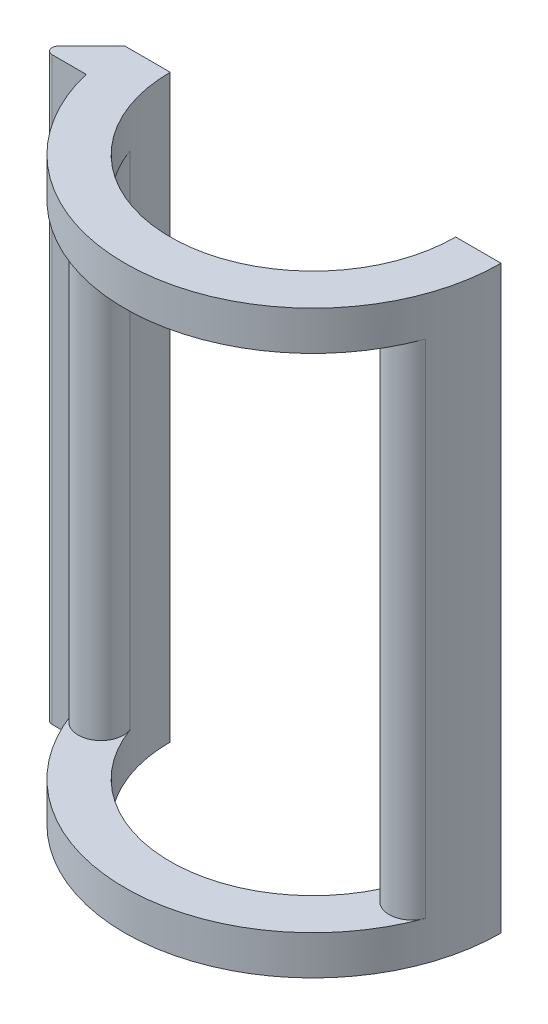
ISO-10303-21;
HEADER;
FILE_DESCRIPTION(('STEP AP214'),'2;1');
FILE_NAME('part.step','',(''),(''),'','','');
FILE_SCHEMA(('AUTOMOTIVE_DESIGN { 1 0 10303 214 1 1 1 1 }'));
ENDSEC;
DATA;
#1=APPLICATION_CONTEXT('core data for automotive mechanical design processes');
#2=APPLICATION_PROTOCOL_DEFINITION('international standard','automotive_design',2000,#1);
#3=PRODUCT_CONTEXT('',#1,'mechanical');
#4=PRODUCT('Part','Part','',(#3));
#5=PRODUCT_RELATED_PRODUCT_CATEGORY('part','',(#4));
#6=PRODUCT_DEFINITION_FORMATION('','',#4);
#7=PRODUCT_DEFINITION_CONTEXT('part definition',#1,'design');
#8=PRODUCT_DEFINITION('design','',#6,#7);
#9=PRODUCT_DEFINITION_SHAPE('','',#8);
#10=(LENGTH_UNIT() NAMED_UNIT(*) SI_UNIT(.MILLI.,.METRE.));
#11=(NAMED_UNIT(*) PLANE_ANGLE_UNIT() SI_UNIT($,.RADIAN.));
#12=(NAMED_UNIT(*) SI_UNIT($,.STERADIAN.) SOLID_ANGLE_UNIT());
#13=UNCERTAINTY_MEASURE_WITH_UNIT(LENGTH_MEASURE(1.E-05),#10,'distance_accuracy_value','');
#14=(GEOMETRIC_REPRESENTATION_CONTEXT(3) GLOBAL_UNCERTAINTY_ASSIGNED_CONTEXT((#13)) GLOBAL_UNIT_ASSIGNED_CONTEXT((#10,
#11,#12)) REPRESENTATION_CONTEXT('',''));
#15=CARTESIAN_POINT('',(0.,0.,0.));
#16=DIRECTION('',(0.,0.,1.));
#17=DIRECTION('',(1.,0.,0.));
#18=AXIS2_PLACEMENT_3D('',#15,#16,#17);
#19=CARTESIAN_POINT('',(0.,117.475,0.));
#20=DIRECTION('',(0.,-1.,0.));
#21=DIRECTION('',(0.,0.,-1.));
#22=AXIS2_PLACEMENT_3D('',#19,#20,#21);
#23=CYLINDRICAL_SURFACE('',#22,28.9052);
#24=DIRECTION('',(0.,-1.,0.));
#25=VECTOR('',#24,1.);
#26=CARTESIAN_POINT('',(27.1620031423408,109.5375,9.88616064685723));
#27=LINE('',#26,#25);
#28=CARTESIAN_POINT('',(27.1620031423408,109.5375,9.88616064685723));
#29=VERTEX_POINT('',#28);
#30=CARTESIAN_POINT('',(27.1620031423408,7.9375,9.88616064685723));
#31=VERTEX_POINT('',#30);
#32=EDGE_CURVE('E61',#29,#31,#27,.T.);
#33=ORIENTED_EDGE('',*,*,#32,.F.);
#34=CARTESIAN_POINT('',(0.,109.5375,0.));
#35=DIRECTION('',(0.,-1.,0.));
#36=DIRECTION('',(0.,0.,-1.));
#37=AXIS2_PLACEMENT_3D('',#34,#35,#36);
#38=CIRCLE('',#37,28.9052);
#39=CARTESIAN_POINT('',(-27.1620031423408,109.5375,9.88616064685723));
#40=VERTEX_POINT('',#39);
#41=EDGE_CURVE('E379',#29,#40,#38,.T.);
#42=ORIENTED_EDGE('',*,*,#41,.T.);
#43=DIRECTION('',(0.,-1.,0.));
#44=VECTOR('',#43,1.);
#45=CARTESIAN_POINT('',(-27.1620031423408,109.5375,9.88616064685723));
#46=LINE('',#45,#44);
#47=CARTESIAN_POINT('',(-27.1620031423408,7.9375,9.88616064685723));
#48=VERTEX_POINT('',#47);
#49=EDGE_CURVE('E147',#40,#48,#46,.T.);
#50=ORIENTED_EDGE('',*,*,#49,.T.);
#51=CARTESIAN_POINT('',(0.,7.9375,0.));
#52=DIRECTION('',(0.,-1.,0.));
#53=DIRECTION('',(0.,0.,-1.));
#54=AXIS2_PLACEMENT_3D('',#51,#52,#53);
#55=CIRCLE('',#54,28.9052);
#56=EDGE_CURVE('E149',#31,#48,#55,.T.);
#57=ORIENTED_EDGE('',*,*,#56,.F.);
#58=EDGE_LOOP('',(#33,#42,#50,#57));
#59=FACE_BOUND('',#58,.T.);
#60=CARTESIAN_POINT('',(0.,0.,0.));
#61=DIRECTION('',(0.,-1.,0.));
#62=DIRECTION('',(0.,0.,1.));
#63=AXIS2_PLACEMENT_3D('',#60,#61,#62);
#64=CIRCLE('',#63,28.9052);
#65=CARTESIAN_POINT('',(28.9052,0.,0.));
#66=VERTEX_POINT('',#65);
#67=CARTESIAN_POINT('',(-28.9052,0.,0.));
#68=VERTEX_POINT('',#67);
#69=EDGE_CURVE('E155',#66,#68,#64,.T.);
#70=ORIENTED_EDGE('',*,*,#69,.T.);
#71=DIRECTION('',(0.,-1.,0.));
#72=VECTOR('',#71,1.);
#73=CARTESIAN_POINT('',(-28.9052,117.475,0.));
#74=LINE('',#73,#72);
#75=CARTESIAN_POINT('',(-28.9052,117.475,0.));
#76=VERTEX_POINT('',#75);
#77=EDGE_CURVE('E217',#76,#68,#74,.T.);
#78=ORIENTED_EDGE('',*,*,#77,.F.);
#79=CARTESIAN_POINT('',(0.,117.475,0.));
#80=DIRECTION('',(0.,-1.,0.));
#81=DIRECTION('',(0.,0.,1.));
#82=AXIS2_PLACEMENT_3D('',#79,#80,#81);
#83=CIRCLE('',#82,28.9052);
#84=CARTESIAN_POINT('',(28.9052,117.475,0.));
#85=VERTEX_POINT('',#84);
#86=EDGE_CURVE('E166',#85,#76,#83,.T.);
#87=ORIENTED_EDGE('',*,*,#86,.F.);
#88=DIRECTION('',(0.,-1.,0.));
#89=VECTOR('',#88,1.);
#90=CARTESIAN_POINT('',(28.9052,117.475,0.));
#91=LINE('',#90,#89);
#92=EDGE_CURVE('E186',#85,#66,#91,.T.);
#93=ORIENTED_EDGE('',*,*,#92,.T.);
#94=EDGE_LOOP('',(#70,#78,#87,#93));
#95=FACE_BOUND('',#94,.T.);
#96=ADVANCED_FACE('F45',(#59,#95),#23,.F.);
#97=CARTESIAN_POINT('',(-28.9052,117.475,0.));
#98=DIRECTION('',(0.,0.,1.));
#99=DIRECTION('',(1.,0.,0.));
#100=AXIS2_PLACEMENT_3D('',#97,#98,#99);
#101=PLANE('',#100);
#102=DIRECTION('',(-1.,0.,0.));
#103=VECTOR('',#102,1.);
#104=CARTESIAN_POINT('',(-28.9052,0.,0.));
#105=LINE('',#104,#103);
#106=CARTESIAN_POINT('',(-38.1,0.,0.));
#107=VERTEX_POINT('',#106);
#108=EDGE_CURVE('E161',#68,#107,#105,.T.);
#109=ORIENTED_EDGE('',*,*,#108,.T.);
#110=DIRECTION('',(0.,-1.,0.));
#111=VECTOR('',#110,1.);
#112=CARTESIAN_POINT('',(-38.1,117.475,0.));
#113=LINE('',#112,#111);
#114=CARTESIAN_POINT('',(-38.1,117.475,0.));
#115=VERTEX_POINT('',#114);
#116=EDGE_CURVE('E213',#115,#107,#113,.T.);
#117=ORIENTED_EDGE('',*,*,#116,.F.);
#118=DIRECTION('',(-1.,0.,0.));
#119=VECTOR('',#118,1.);
#120=CARTESIAN_POINT('',(-28.9052,117.475,0.));
#121=LINE('',#120,#119);
#122=EDGE_CURVE('E170',#76,#115,#121,.T.);
#123=ORIENTED_EDGE('',*,*,#122,.F.);
#124=ORIENTED_EDGE('',*,*,#77,.T.);
#125=EDGE_LOOP('',(#109,#117,#123,#124));
#126=FACE_BOUND('',#125,.T.);
#127=ADVANCED_FACE('F259',(#126),#101,.F.);
#128=CARTESIAN_POINT('',(-46.99,117.475,8.89));
#129=DIRECTION('',(0.707106781186547,0.,0.707106781186548));
#130=DIRECTION('',(0.707106781186548,0.,-0.707106781186547));
#131=AXIS2_PLACEMENT_3D('',#128,#129,#130);
#132=PLANE('',#131);
#133=DIRECTION('',(-0.707106781186548,0.,0.707106781186547));
#134=VECTOR('',#133,1.);
#135=CARTESIAN_POINT('',(-46.99,0.,8.89));
#136=LINE('',#135,#134);
#137=CARTESIAN_POINT('',(-44.8219743878931,0.,6.72197438789308));
#138=VERTEX_POINT('',#137);
#139=EDGE_CURVE('E190',#107,#138,#136,.T.);
#140=ORIENTED_EDGE('',*,*,#139,.T.);
#141=DIRECTION('',(0.,-1.,0.));
#142=VECTOR('',#141,1.);
#143=CARTESIAN_POINT('',(-44.8219743878931,117.475,6.72197438789308));
#144=LINE('',#143,#142);
#145=CARTESIAN_POINT('',(-44.8219743878931,117.475,6.72197438789308));
#146=VERTEX_POINT('',#145);
#147=EDGE_CURVE('E54',#138,#146,#144,.F.);
#148=ORIENTED_EDGE('',*,*,#147,.T.);
#149=DIRECTION('',(-0.707106781186548,0.,0.707106781186547));
#150=VECTOR('',#149,1.);
#151=CARTESIAN_POINT('',(-46.99,117.475,8.89));
#152=LINE('',#151,#150);
#153=EDGE_CURVE('E174',#115,#146,#152,.T.);
#154=ORIENTED_EDGE('',*,*,#153,.F.);
#155=ORIENTED_EDGE('',*,*,#116,.T.);
#156=EDGE_LOOP('',(#140,#148,#154,#155));
#157=FACE_BOUND('',#156,.T.);
#158=ADVANCED_FACE('F231',(#157),#132,.F.);
#159=CARTESIAN_POINT('',(-38.1,117.475,8.89));
#160=DIRECTION('',(0.,0.,-1.));
#161=DIRECTION('',(-1.,0.,0.));
#162=AXIS2_PLACEMENT_3D('',#159,#160,#161);
#163=PLANE('',#162);
#164=DIRECTION('',(1.,0.,0.));
#165=VECTOR('',#164,1.);
#166=CARTESIAN_POINT('',(-38.1,117.475,8.89));
#167=LINE('',#166,#165);
#168=CARTESIAN_POINT('',(-43.9239487757862,117.475,8.89));
#169=VERTEX_POINT('',#168);
#170=CARTESIAN_POINT('',(-37.0483184503697,117.475,8.89));
#171=VERTEX_POINT('',#170);
#172=EDGE_CURVE('E178',#169,#171,#167,.T.);
#173=ORIENTED_EDGE('',*,*,#172,.F.);
#174=DIRECTION('',(0.,-1.,0.));
#175=VECTOR('',#174,1.);
#176=CARTESIAN_POINT('',(-43.9239487757862,117.475,8.89));
#177=LINE('',#176,#175);
#178=CARTESIAN_POINT('',(-43.9239487757862,0.,8.89));
#179=VERTEX_POINT('',#178);
#180=EDGE_CURVE('E221',#169,#179,#177,.T.);
#181=ORIENTED_EDGE('',*,*,#180,.T.);
#182=DIRECTION('',(1.,0.,0.));
#183=VECTOR('',#182,1.);
#184=CARTESIAN_POINT('',(-38.1,0.,8.89));
#185=LINE('',#184,#183);
#186=CARTESIAN_POINT('',(-37.0483184503697,0.,8.89));
#187=VERTEX_POINT('',#186);
#188=EDGE_CURVE('E194',#179,#187,#185,.T.);
#189=ORIENTED_EDGE('',*,*,#188,.T.);
#190=DIRECTION('',(0.,-1.,0.));
#191=VECTOR('',#190,1.);
#192=CARTESIAN_POINT('',(-37.0483184503697,117.475,8.89));
#193=LINE('',#192,#191);
#194=EDGE_CURVE('E209',#171,#187,#193,.T.);
#195=ORIENTED_EDGE('',*,*,#194,.F.);
#196=EDGE_LOOP('',(#173,#181,#189,#195));
#197=FACE_BOUND('',#196,.T.);
#198=ADVANCED_FACE('F242',(#197),#163,.F.);
#199=CARTESIAN_POINT('',(0.,117.475,0.));
#200=DIRECTION('',(0.,-1.,0.));
#201=DIRECTION('',(0.,0.,-1.));
#202=AXIS2_PLACEMENT_3D('',#199,#200,#201);
#203=CYLINDRICAL_SURFACE('',#202,38.1);
#204=DIRECTION('',(0.,-1.,0.));
#205=VECTOR('',#204,1.);
#206=CARTESIAN_POINT('',(-35.8022888519431,109.5375,13.0309674607081));
#207=LINE('',#206,#205);
#208=CARTESIAN_POINT('',(-35.8022888519431,109.5375,13.0309674607081));
#209=VERTEX_POINT('',#208);
#210=CARTESIAN_POINT('',(-35.8022888519431,7.9375,13.0309674607081));
#211=VERTEX_POINT('',#210);
#212=EDGE_CURVE('E144',#209,#211,#207,.T.);
#213=ORIENTED_EDGE('',*,*,#212,.F.);
#214=CARTESIAN_POINT('',(0.,109.5375,0.));
#215=DIRECTION('',(0.,1.,0.));
#216=DIRECTION('',(0.,0.,1.));
#217=AXIS2_PLACEMENT_3D('',#214,#215,#216);
#218=CIRCLE('',#217,38.1);
#219=CARTESIAN_POINT('',(35.8022888519431,109.5375,13.0309674607081));
#220=VERTEX_POINT('',#219);
#221=EDGE_CURVE('E130',#209,#220,#218,.T.);
#222=ORIENTED_EDGE('',*,*,#221,.T.);
#223=DIRECTION('',(0.,-1.,0.));
#224=VECTOR('',#223,1.);
#225=CARTESIAN_POINT('',(35.8022888519431,109.5375,13.0309674607081));
#226=LINE('',#225,#224);
#227=CARTESIAN_POINT('',(35.8022888519431,7.9375,13.0309674607081));
#228=VERTEX_POINT('',#227);
#229=EDGE_CURVE('E156',#220,#228,#226,.T.);
#230=ORIENTED_EDGE('',*,*,#229,.T.);
#231=CARTESIAN_POINT('',(0.,7.9375,0.));
#232=DIRECTION('',(0.,1.,0.));
#233=DIRECTION('',(0.,0.,1.));
#234=AXIS2_PLACEMENT_3D('',#231,#232,#233);
#235=CIRCLE('',#234,38.1);
#236=EDGE_CURVE('E153',#211,#228,#235,.T.);
#237=ORIENTED_EDGE('',*,*,#236,.F.);
#238=EDGE_LOOP('',(#213,#222,#230,#237));
#239=FACE_BOUND('',#238,.T.);
#240=CARTESIAN_POINT('',(0.,0.,0.));
#241=DIRECTION('',(0.,1.,0.));
#242=DIRECTION('',(0.,0.,-1.));
#243=AXIS2_PLACEMENT_3D('',#240,#241,#242);
#244=CIRCLE('',#243,38.1);
#245=CARTESIAN_POINT('',(38.1,0.,0.));
#246=VERTEX_POINT('',#245);
#247=EDGE_CURVE('E197',#187,#246,#244,.T.);
#248=ORIENTED_EDGE('',*,*,#247,.T.);
#249=DIRECTION('',(0.,-1.,0.));
#250=VECTOR('',#249,1.);
#251=CARTESIAN_POINT('',(38.1,117.475,0.));
#252=LINE('',#251,#250);
#253=CARTESIAN_POINT('',(38.1,117.475,0.));
#254=VERTEX_POINT('',#253);
#255=EDGE_CURVE('E205',#254,#246,#252,.T.);
#256=ORIENTED_EDGE('',*,*,#255,.F.);
#257=CARTESIAN_POINT('',(0.,117.475,0.));
#258=DIRECTION('',(0.,1.,0.));
#259=DIRECTION('',(0.,0.,-1.));
#260=AXIS2_PLACEMENT_3D('',#257,#258,#259);
#261=CIRCLE('',#260,38.1);
#262=EDGE_CURVE('E181',#171,#254,#261,.T.);
#263=ORIENTED_EDGE('',*,*,#262,.F.);
#264=ORIENTED_EDGE('',*,*,#194,.T.);
#265=EDGE_LOOP('',(#248,#256,#263,#264));
#266=FACE_BOUND('',#265,.T.);
#267=ADVANCED_FACE('F151',(#239,#266),#203,.T.);
#268=CARTESIAN_POINT('',(28.9052,117.475,0.));
#269=DIRECTION('',(0.,0.,1.));
#270=DIRECTION('',(1.,0.,0.));
#271=AXIS2_PLACEMENT_3D('',#268,#269,#270);
#272=PLANE('',#271);
#273=DIRECTION('',(-1.,0.,0.));
#274=VECTOR('',#273,1.);
#275=CARTESIAN_POINT('',(28.9052,0.,0.));
#276=LINE('',#275,#274);
#277=EDGE_CURVE('E171',#246,#66,#276,.T.);
#278=ORIENTED_EDGE('',*,*,#277,.T.);
#279=ORIENTED_EDGE('',*,*,#92,.F.);
#280=DIRECTION('',(-1.,0.,0.));
#281=VECTOR('',#280,1.);
#282=CARTESIAN_POINT('',(28.9052,117.475,0.));
#283=LINE('',#282,#281);
#284=EDGE_CURVE('E184',#254,#85,#283,.T.);
#285=ORIENTED_EDGE('',*,*,#284,.F.);
#286=ORIENTED_EDGE('',*,*,#255,.T.);
#287=EDGE_LOOP('',(#278,#279,#285,#286));
#288=FACE_BOUND('',#287,.T.);
#289=ADVANCED_FACE('F253',(#288),#272,.F.);
#290=CARTESIAN_POINT('',(0.,117.475,0.));
#291=DIRECTION('',(0.,1.,0.));
#292=DIRECTION('',(0.,0.,1.));
#293=AXIS2_PLACEMENT_3D('',#290,#291,#292);
#294=PLANE('',#293);
#295=ORIENTED_EDGE('',*,*,#153,.T.);
#296=CARTESIAN_POINT('',(-43.9239487757862,117.475,7.62));
#297=DIRECTION('',(0.,1.,0.));
#298=DIRECTION('',(0.,0.,1.));
#299=AXIS2_PLACEMENT_3D('',#296,#297,#298);
#300=CIRCLE('',#299,1.27);
#301=EDGE_CURVE('E11',#146,#169,#300,.T.);
#302=ORIENTED_EDGE('',*,*,#301,.T.);
#303=ORIENTED_EDGE('',*,*,#172,.T.);
#304=ORIENTED_EDGE('',*,*,#262,.T.);
#305=ORIENTED_EDGE('',*,*,#284,.T.);
#306=ORIENTED_EDGE('',*,*,#86,.T.);
#307=ORIENTED_EDGE('',*,*,#122,.T.);
#308=EDGE_LOOP('',(#295,#302,#303,#304,#305,#306,#307));
#309=FACE_BOUND('',#308,.T.);
#310=ADVANCED_FACE('F236',(#309),#294,.T.);
#311=CARTESIAN_POINT('',(0.,0.,0.));
#312=DIRECTION('',(0.,1.,0.));
#313=DIRECTION('',(0.,0.,1.));
#314=AXIS2_PLACEMENT_3D('',#311,#312,#313);
#315=PLANE('',#314);
#316=ORIENTED_EDGE('',*,*,#188,.F.);
#317=CARTESIAN_POINT('',(-43.9239487757862,0.,7.62));
#318=DIRECTION('',(0.,1.,0.));
#319=DIRECTION('',(0.,0.,1.));
#320=AXIS2_PLACEMENT_3D('',#317,#318,#319);
#321=CIRCLE('',#320,1.27);
#322=EDGE_CURVE('E225',#179,#138,#321,.F.);
#323=ORIENTED_EDGE('',*,*,#322,.T.);
#324=ORIENTED_EDGE('',*,*,#139,.F.);
#325=ORIENTED_EDGE('',*,*,#108,.F.);
#326=ORIENTED_EDGE('',*,*,#69,.F.);
#327=ORIENTED_EDGE('',*,*,#277,.F.);
#328=ORIENTED_EDGE('',*,*,#247,.F.);
#329=EDGE_LOOP('',(#316,#323,#324,#325,#326,#327,#328));
#330=FACE_BOUND('',#329,.T.);
#331=ADVANCED_FACE('F246',(#330),#315,.F.);
#332=CARTESIAN_POINT('',(-43.9239487757862,117.475,7.62));
#333=DIRECTION('',(0.,-1.,0.));
#334=DIRECTION('',(0.,0.,-1.));
#335=AXIS2_PLACEMENT_3D('',#332,#333,#334);
#336=CYLINDRICAL_SURFACE('',#335,1.27);
#337=ORIENTED_EDGE('',*,*,#301,.F.);
#338=ORIENTED_EDGE('',*,*,#147,.F.);
#339=ORIENTED_EDGE('',*,*,#322,.F.);
#340=ORIENTED_EDGE('',*,*,#180,.F.);
#341=EDGE_LOOP('',(#337,#338,#339,#340));
#342=FACE_BOUND('',#341,.T.);
#343=ADVANCED_FACE('F47',(#342),#336,.T.);
#344=CARTESIAN_POINT('',(-31.4821459971419,109.5375,11.4585640537827));
#345=DIRECTION('',(0.,-1.,0.));
#346=DIRECTION('',(0.,0.,-1.));
#347=AXIS2_PLACEMENT_3D('',#344,#345,#346);
#348=CYLINDRICAL_SURFACE('',#347,4.5974);
#349=CARTESIAN_POINT('',(-31.4821459971419,7.9375,11.4585640537827));
#350=DIRECTION('',(0.,-1.,0.));
#351=DIRECTION('',(0.,0.,1.));
#352=AXIS2_PLACEMENT_3D('',#349,#350,#351);
#353=CIRCLE('',#352,4.5974);
#354=EDGE_CURVE('E69',#48,#211,#353,.T.);
#355=ORIENTED_EDGE('',*,*,#354,.F.);
#356=ORIENTED_EDGE('',*,*,#49,.F.);
#357=CARTESIAN_POINT('',(-31.4821459971419,109.5375,11.4585640537827));
#358=DIRECTION('',(0.,-1.,0.));
#359=DIRECTION('',(0.,0.,1.));
#360=AXIS2_PLACEMENT_3D('',#357,#358,#359);
#361=CIRCLE('',#360,4.5974);
#362=EDGE_CURVE('E134',#40,#209,#361,.T.);
#363=ORIENTED_EDGE('',*,*,#362,.T.);
#364=ORIENTED_EDGE('',*,*,#212,.T.);
#365=EDGE_LOOP('',(#355,#356,#363,#364));
#366=FACE_BOUND('',#365,.T.);
#367=ADVANCED_FACE('F143',(#366),#348,.T.);
#368=CARTESIAN_POINT('',(31.4821459971419,109.5375,11.4585640537827));
#369=DIRECTION('',(0.,-1.,0.));
#370=DIRECTION('',(0.,0.,-1.));
#371=AXIS2_PLACEMENT_3D('',#368,#369,#370);
#372=CYLINDRICAL_SURFACE('',#371,4.59740000000001);
#373=CARTESIAN_POINT('',(31.4821459971419,7.9375,11.4585640537827));
#374=DIRECTION('',(0.,-1.,0.));
#375=DIRECTION('',(0.,0.,-1.));
#376=AXIS2_PLACEMENT_3D('',#373,#374,#375);
#377=CIRCLE('',#376,4.59740000000001);
#378=EDGE_CURVE('E368',#228,#31,#377,.T.);
#379=ORIENTED_EDGE('',*,*,#378,.F.);
#380=ORIENTED_EDGE('',*,*,#229,.F.);
#381=CARTESIAN_POINT('',(31.4821459971419,109.5375,11.4585640537827));
#382=DIRECTION('',(0.,-1.,0.));
#383=DIRECTION('',(0.,0.,-1.));
#384=AXIS2_PLACEMENT_3D('',#381,#382,#383);
#385=CIRCLE('',#384,4.59740000000001);
#386=EDGE_CURVE('E136',#220,#29,#385,.T.);
#387=ORIENTED_EDGE('',*,*,#386,.T.);
#388=ORIENTED_EDGE('',*,*,#32,.T.);
#389=EDGE_LOOP('',(#379,#380,#387,#388));
#390=FACE_BOUND('',#389,.T.);
#391=ADVANCED_FACE('F281',(#390),#372,.T.);
#392=CARTESIAN_POINT('',(-15.741072998571,109.5375,5.72928202689134));
#393=DIRECTION('',(0.,1.,0.));
#394=DIRECTION('',(0.,0.,1.));
#395=AXIS2_PLACEMENT_3D('',#392,#393,#394);
#396=PLANE('',#395);
#397=ORIENTED_EDGE('',*,*,#362,.F.);
#398=ORIENTED_EDGE('',*,*,#41,.F.);
#399=ORIENTED_EDGE('',*,*,#386,.F.);
#400=ORIENTED_EDGE('',*,*,#221,.F.);
#401=EDGE_LOOP('',(#397,#398,#399,#400));
#402=FACE_BOUND('',#401,.T.);
#403=ADVANCED_FACE('F132',(#402),#396,.F.);
#404=CARTESIAN_POINT('',(-15.741072998571,7.9375,5.72928202689134));
#405=DIRECTION('',(0.,1.,0.));
#406=DIRECTION('',(0.,0.,1.));
#407=AXIS2_PLACEMENT_3D('',#404,#405,#406);
#408=PLANE('',#407);
#409=ORIENTED_EDGE('',*,*,#354,.T.);
#410=ORIENTED_EDGE('',*,*,#236,.T.);
#411=ORIENTED_EDGE('',*,*,#378,.T.);
#412=ORIENTED_EDGE('',*,*,#56,.T.);
#413=EDGE_LOOP('',(#409,#410,#411,#412));
#414=FACE_BOUND('',#413,.T.);
#415=ADVANCED_FACE('F284',(#414),#408,.T.);
#416=CLOSED_SHELL('',(#96,#127,#158,#198,#267,#289,#310,#331,#343,#367,#391,#403,#415));
#417=MANIFOLD_SOLID_BREP('B2',#416);
#418=ADVANCED_BREP_SHAPE_REPRESENTATION('',(#18,#417),#14);
#419=SHAPE_DEFINITION_REPRESENTATION(#9,#418);
ENDSEC;
END-ISO-10303-21;
